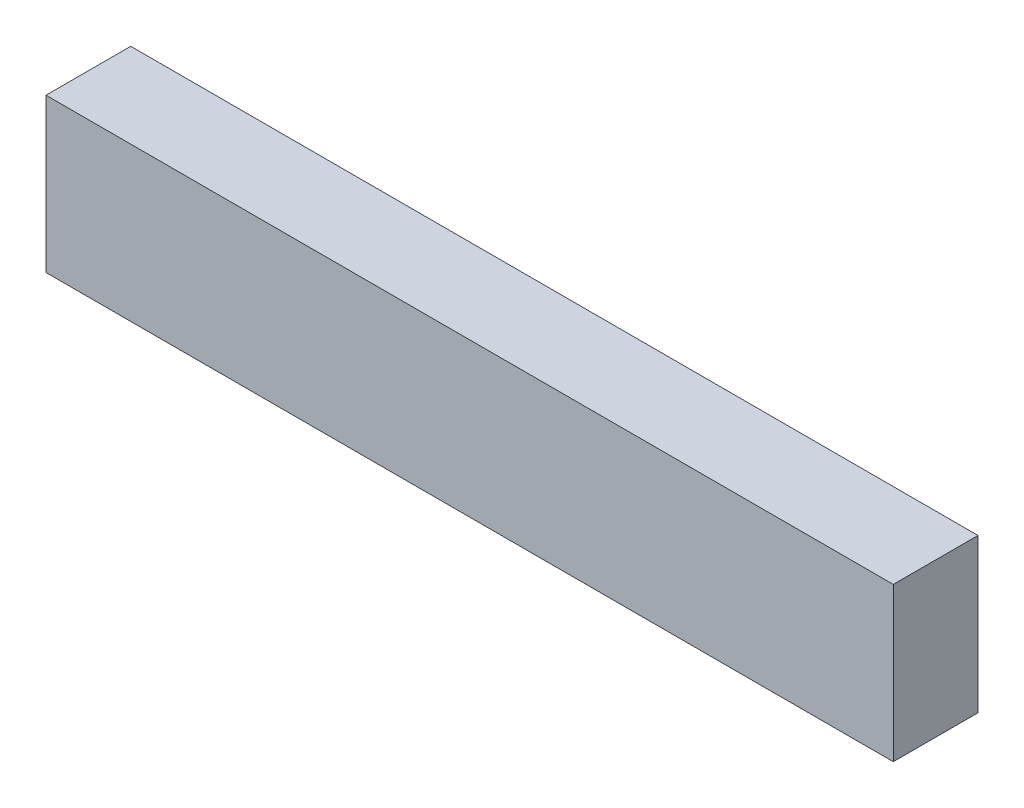
ISO-10303-21;
HEADER;
FILE_DESCRIPTION(('STEP AP214'),'2;1');
FILE_NAME('part.step','',(''),(''),'','','');
FILE_SCHEMA(('AUTOMOTIVE_DESIGN { 1 0 10303 214 1 1 1 1 }'));
ENDSEC;
DATA;
#1=APPLICATION_CONTEXT('core data for automotive mechanical design processes');
#2=APPLICATION_PROTOCOL_DEFINITION('international standard','automotive_design',2000,#1);
#3=PRODUCT_CONTEXT('',#1,'mechanical');
#4=PRODUCT('Part','Part','',(#3));
#5=PRODUCT_RELATED_PRODUCT_CATEGORY('part','',(#4));
#6=PRODUCT_DEFINITION_FORMATION('','',#4);
#7=PRODUCT_DEFINITION_CONTEXT('part definition',#1,'design');
#8=PRODUCT_DEFINITION('design','',#6,#7);
#9=PRODUCT_DEFINITION_SHAPE('','',#8);
#10=(LENGTH_UNIT() NAMED_UNIT(*) SI_UNIT(.MILLI.,.METRE.));
#11=(NAMED_UNIT(*) PLANE_ANGLE_UNIT() SI_UNIT($,.RADIAN.));
#12=(NAMED_UNIT(*) SI_UNIT($,.STERADIAN.) SOLID_ANGLE_UNIT());
#13=UNCERTAINTY_MEASURE_WITH_UNIT(LENGTH_MEASURE(1.E-05),#10,'distance_accuracy_value','');
#14=(GEOMETRIC_REPRESENTATION_CONTEXT(3) GLOBAL_UNCERTAINTY_ASSIGNED_CONTEXT((#13)) GLOBAL_UNIT_ASSIGNED_CONTEXT((#10,
#11,#12)) REPRESENTATION_CONTEXT('',''));
#15=CARTESIAN_POINT('',(0.,0.,0.));
#16=DIRECTION('',(0.,0.,1.));
#17=DIRECTION('',(1.,0.,0.));
#18=AXIS2_PLACEMENT_3D('',#15,#16,#17);
#19=CARTESIAN_POINT('',(-40.,14.5,-3.99999999999999));
#20=DIRECTION('',(1.,0.,0.));
#21=DIRECTION('',(0.,0.,-1.));
#22=AXIS2_PLACEMENT_3D('',#19,#20,#21);
#23=PLANE('',#22);
#24=DIRECTION('',(0.,0.,1.));
#25=VECTOR('',#24,1.);
#26=CARTESIAN_POINT('',(-40.,0.,-3.99999999999999));
#27=LINE('',#26,#25);
#28=CARTESIAN_POINT('',(-40.,0.,-3.99999999999999));
#29=VERTEX_POINT('',#28);
#30=CARTESIAN_POINT('',(-40.,0.,4.00000000000001));
#31=VERTEX_POINT('',#30);
#32=EDGE_CURVE('E97',#29,#31,#27,.T.);
#33=ORIENTED_EDGE('',*,*,#32,.T.);
#34=DIRECTION('',(0.,-1.,0.));
#35=VECTOR('',#34,1.);
#36=CARTESIAN_POINT('',(-40.,14.5,4.00000000000001));
#37=LINE('',#36,#35);
#38=CARTESIAN_POINT('',(-40.,14.5,4.00000000000001));
#39=VERTEX_POINT('',#38);
#40=EDGE_CURVE('E11',#39,#31,#37,.T.);
#41=ORIENTED_EDGE('',*,*,#40,.F.);
#42=DIRECTION('',(0.,0.,1.));
#43=VECTOR('',#42,1.);
#44=CARTESIAN_POINT('',(-40.,14.5,-3.99999999999999));
#45=LINE('',#44,#43);
#46=CARTESIAN_POINT('',(-40.,14.5,-3.99999999999999));
#47=VERTEX_POINT('',#46);
#48=EDGE_CURVE('E85',#47,#39,#45,.T.);
#49=ORIENTED_EDGE('',*,*,#48,.F.);
#50=DIRECTION('',(0.,-1.,0.));
#51=VECTOR('',#50,1.);
#52=CARTESIAN_POINT('',(-40.,14.5,-3.99999999999999));
#53=LINE('',#52,#51);
#54=EDGE_CURVE('E93',#47,#29,#53,.T.);
#55=ORIENTED_EDGE('',*,*,#54,.T.);
#56=EDGE_LOOP('',(#33,#41,#49,#55));
#57=FACE_BOUND('',#56,.T.);
#58=ADVANCED_FACE('F34',(#57),#23,.F.);
#59=CARTESIAN_POINT('',(40.,14.5,4.));
#60=DIRECTION('',(0.,0.,-1.));
#61=DIRECTION('',(-1.,0.,0.));
#62=AXIS2_PLACEMENT_3D('',#59,#60,#61);
#63=PLANE('',#62);
#64=DIRECTION('',(1.,0.,0.));
#65=VECTOR('',#64,1.);
#66=CARTESIAN_POINT('',(40.,0.,4.));
#67=LINE('',#66,#65);
#68=CARTESIAN_POINT('',(40.,0.,4.));
#69=VERTEX_POINT('',#68);
#70=EDGE_CURVE('E89',#31,#69,#67,.T.);
#71=ORIENTED_EDGE('',*,*,#70,.T.);
#72=DIRECTION('',(0.,-1.,0.));
#73=VECTOR('',#72,1.);
#74=CARTESIAN_POINT('',(40.,14.5,4.));
#75=LINE('',#74,#73);
#76=CARTESIAN_POINT('',(40.,14.5,4.));
#77=VERTEX_POINT('',#76);
#78=EDGE_CURVE('E42',#77,#69,#75,.T.);
#79=ORIENTED_EDGE('',*,*,#78,.F.);
#80=DIRECTION('',(1.,0.,0.));
#81=VECTOR('',#80,1.);
#82=CARTESIAN_POINT('',(40.,14.5,4.));
#83=LINE('',#82,#81);
#84=EDGE_CURVE('E80',#39,#77,#83,.T.);
#85=ORIENTED_EDGE('',*,*,#84,.F.);
#86=ORIENTED_EDGE('',*,*,#40,.T.);
#87=EDGE_LOOP('',(#71,#79,#85,#86));
#88=FACE_BOUND('',#87,.T.);
#89=ADVANCED_FACE('F88',(#88),#63,.F.);
#90=CARTESIAN_POINT('',(40.,14.5,-4.));
#91=DIRECTION('',(-1.,0.,0.));
#92=DIRECTION('',(0.,0.,1.));
#93=AXIS2_PLACEMENT_3D('',#90,#91,#92);
#94=PLANE('',#93);
#95=DIRECTION('',(0.,0.,-1.));
#96=VECTOR('',#95,1.);
#97=CARTESIAN_POINT('',(40.,0.,-4.));
#98=LINE('',#97,#96);
#99=CARTESIAN_POINT('',(40.,0.,-4.));
#100=VERTEX_POINT('',#99);
#101=EDGE_CURVE('E67',#69,#100,#98,.T.);
#102=ORIENTED_EDGE('',*,*,#101,.T.);
#103=DIRECTION('',(0.,-1.,0.));
#104=VECTOR('',#103,1.);
#105=CARTESIAN_POINT('',(40.,14.5,-4.));
#106=LINE('',#105,#104);
#107=CARTESIAN_POINT('',(40.,14.5,-4.));
#108=VERTEX_POINT('',#107);
#109=EDGE_CURVE('E90',#108,#100,#106,.T.);
#110=ORIENTED_EDGE('',*,*,#109,.F.);
#111=DIRECTION('',(0.,0.,-1.));
#112=VECTOR('',#111,1.);
#113=CARTESIAN_POINT('',(40.,14.5,-4.));
#114=LINE('',#113,#112);
#115=EDGE_CURVE('E83',#77,#108,#114,.T.);
#116=ORIENTED_EDGE('',*,*,#115,.F.);
#117=ORIENTED_EDGE('',*,*,#78,.T.);
#118=EDGE_LOOP('',(#102,#110,#116,#117));
#119=FACE_BOUND('',#118,.T.);
#120=ADVANCED_FACE('F91',(#119),#94,.F.);
#121=CARTESIAN_POINT('',(40.,14.5,-4.));
#122=DIRECTION('',(0.,0.,1.));
#123=DIRECTION('',(1.,0.,0.));
#124=AXIS2_PLACEMENT_3D('',#121,#122,#123);
#125=PLANE('',#124);
#126=DIRECTION('',(-1.,0.,0.));
#127=VECTOR('',#126,1.);
#128=CARTESIAN_POINT('',(40.,0.,-4.));
#129=LINE('',#128,#127);
#130=EDGE_CURVE('E73',#100,#29,#129,.T.);
#131=ORIENTED_EDGE('',*,*,#130,.T.);
#132=ORIENTED_EDGE('',*,*,#54,.F.);
#133=DIRECTION('',(-1.,0.,0.));
#134=VECTOR('',#133,1.);
#135=CARTESIAN_POINT('',(40.,14.5,-4.));
#136=LINE('',#135,#134);
#137=EDGE_CURVE('E50',#108,#47,#136,.T.);
#138=ORIENTED_EDGE('',*,*,#137,.F.);
#139=ORIENTED_EDGE('',*,*,#109,.T.);
#140=EDGE_LOOP('',(#131,#132,#138,#139));
#141=FACE_BOUND('',#140,.T.);
#142=ADVANCED_FACE('F104',(#141),#125,.F.);
#143=CARTESIAN_POINT('',(0.,14.5,0.));
#144=DIRECTION('',(0.,-1.,0.));
#145=DIRECTION('',(0.,0.,-1.));
#146=AXIS2_PLACEMENT_3D('',#143,#144,#145);
#147=PLANE('',#146);
#148=ORIENTED_EDGE('',*,*,#48,.T.);
#149=ORIENTED_EDGE('',*,*,#84,.T.);
#150=ORIENTED_EDGE('',*,*,#115,.T.);
#151=ORIENTED_EDGE('',*,*,#137,.T.);
#152=EDGE_LOOP('',(#148,#149,#150,#151));
#153=FACE_BOUND('',#152,.T.);
#154=ADVANCED_FACE('F81',(#153),#147,.F.);
#155=CARTESIAN_POINT('',(0.,0.,0.));
#156=DIRECTION('',(0.,-1.,0.));
#157=DIRECTION('',(0.,0.,-1.));
#158=AXIS2_PLACEMENT_3D('',#155,#156,#157);
#159=PLANE('',#158);
#160=ORIENTED_EDGE('',*,*,#32,.F.);
#161=ORIENTED_EDGE('',*,*,#130,.F.);
#162=ORIENTED_EDGE('',*,*,#101,.F.);
#163=ORIENTED_EDGE('',*,*,#70,.F.);
#164=EDGE_LOOP('',(#160,#161,#162,#163));
#165=FACE_BOUND('',#164,.T.);
#166=ADVANCED_FACE('F107',(#165),#159,.T.);
#167=CLOSED_SHELL('',(#58,#89,#120,#142,#154,#166));
#168=MANIFOLD_SOLID_BREP('B2',#167);
#169=ADVANCED_BREP_SHAPE_REPRESENTATION('',(#18,#168),#14);
#170=SHAPE_DEFINITION_REPRESENTATION(#9,#169);
ENDSEC;
END-ISO-10303-21;
